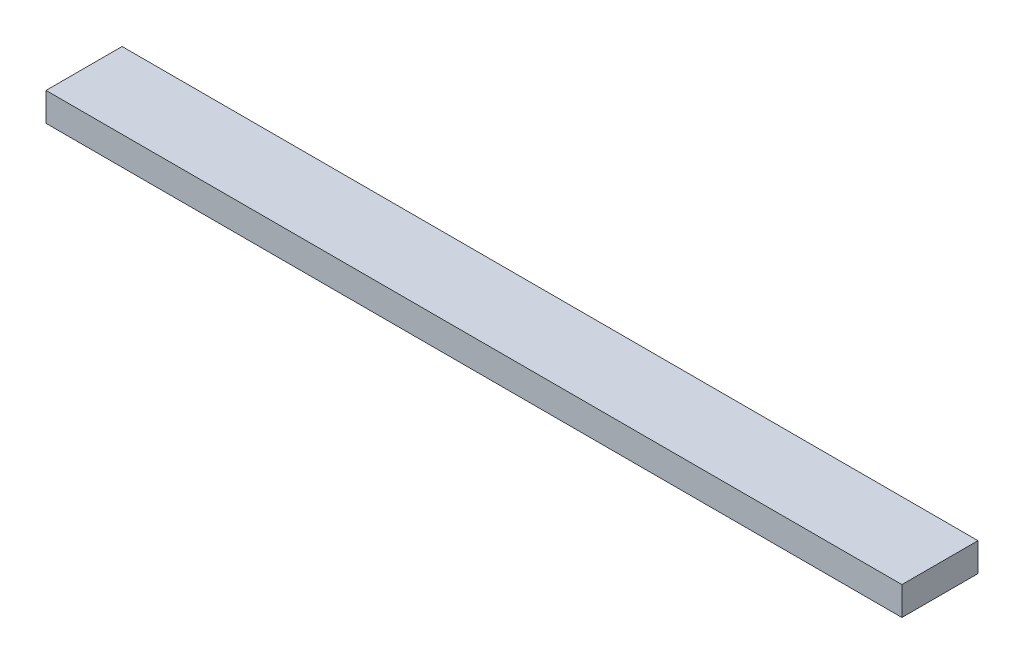
ISO-10303-21;
HEADER;
FILE_DESCRIPTION(('STEP AP214'),'2;1');
FILE_NAME('part.step','',(''),(''),'','','');
FILE_SCHEMA(('AUTOMOTIVE_DESIGN { 1 0 10303 214 1 1 1 1 }'));
ENDSEC;
DATA;
#1=APPLICATION_CONTEXT('core data for automotive mechanical design processes');
#2=APPLICATION_PROTOCOL_DEFINITION('international standard','automotive_design',2000,#1);
#3=PRODUCT_CONTEXT('',#1,'mechanical');
#4=PRODUCT('Part','Part','',(#3));
#5=PRODUCT_RELATED_PRODUCT_CATEGORY('part','',(#4));
#6=PRODUCT_DEFINITION_FORMATION('','',#4);
#7=PRODUCT_DEFINITION_CONTEXT('part definition',#1,'design');
#8=PRODUCT_DEFINITION('design','',#6,#7);
#9=PRODUCT_DEFINITION_SHAPE('','',#8);
#10=(LENGTH_UNIT() NAMED_UNIT(*) SI_UNIT(.MILLI.,.METRE.));
#11=(NAMED_UNIT(*) PLANE_ANGLE_UNIT() SI_UNIT($,.RADIAN.));
#12=(NAMED_UNIT(*) SI_UNIT($,.STERADIAN.) SOLID_ANGLE_UNIT());
#13=UNCERTAINTY_MEASURE_WITH_UNIT(LENGTH_MEASURE(1.E-05),#10,'distance_accuracy_value','');
#14=(GEOMETRIC_REPRESENTATION_CONTEXT(3) GLOBAL_UNCERTAINTY_ASSIGNED_CONTEXT((#13)) GLOBAL_UNIT_ASSIGNED_CONTEXT((#10,
#11,#12)) REPRESENTATION_CONTEXT('',''));
#15=CARTESIAN_POINT('',(0.,0.,0.));
#16=DIRECTION('',(0.,0.,1.));
#17=DIRECTION('',(1.,0.,0.));
#18=AXIS2_PLACEMENT_3D('',#15,#16,#17);
#19=CARTESIAN_POINT('',(-9.78343949044586,3.,-4.48407643312102));
#20=DIRECTION('',(-1.,0.,0.));
#21=DIRECTION('',(0.,0.,1.));
#22=AXIS2_PLACEMENT_3D('',#19,#20,#21);
#23=PLANE('',#22);
#24=DIRECTION('',(0.,0.,-1.));
#25=VECTOR('',#24,1.);
#26=CARTESIAN_POINT('',(-9.78343949044586,0.,-4.48407643312102));
#27=LINE('',#26,#25);
#28=CARTESIAN_POINT('',(-9.78343949044586,0.,-4.48407643312102));
#29=VERTEX_POINT('',#28);
#30=CARTESIAN_POINT('',(-9.78343949044586,0.,-12.484076433121));
#31=VERTEX_POINT('',#30);
#32=EDGE_CURVE('E96',#29,#31,#27,.T.);
#33=ORIENTED_EDGE('',*,*,#32,.T.);
#34=DIRECTION('',(0.,-1.,0.));
#35=VECTOR('',#34,1.);
#36=CARTESIAN_POINT('',(-9.78343949044586,3.,-12.484076433121));
#37=LINE('',#36,#35);
#38=CARTESIAN_POINT('',(-9.78343949044586,3.,-12.484076433121));
#39=VERTEX_POINT('',#38);
#40=EDGE_CURVE('E11',#39,#31,#37,.T.);
#41=ORIENTED_EDGE('',*,*,#40,.F.);
#42=DIRECTION('',(0.,0.,-1.));
#43=VECTOR('',#42,1.);
#44=CARTESIAN_POINT('',(-9.78343949044586,3.,-4.48407643312102));
#45=LINE('',#44,#43);
#46=CARTESIAN_POINT('',(-9.78343949044586,3.,-4.48407643312102));
#47=VERTEX_POINT('',#46);
#48=EDGE_CURVE('E84',#47,#39,#45,.T.);
#49=ORIENTED_EDGE('',*,*,#48,.F.);
#50=DIRECTION('',(0.,-1.,0.));
#51=VECTOR('',#50,1.);
#52=CARTESIAN_POINT('',(-9.78343949044586,3.,-4.48407643312102));
#53=LINE('',#52,#51);
#54=EDGE_CURVE('E92',#47,#29,#53,.T.);
#55=ORIENTED_EDGE('',*,*,#54,.T.);
#56=EDGE_LOOP('',(#33,#41,#49,#55));
#57=FACE_BOUND('',#56,.T.);
#58=ADVANCED_FACE('F33',(#57),#23,.F.);
#59=CARTESIAN_POINT('',(-9.78343949044586,3.,-12.484076433121));
#60=DIRECTION('',(0.,0.,1.));
#61=DIRECTION('',(1.,0.,0.));
#62=AXIS2_PLACEMENT_3D('',#59,#60,#61);
#63=PLANE('',#62);
#64=DIRECTION('',(-1.,0.,0.));
#65=VECTOR('',#64,1.);
#66=CARTESIAN_POINT('',(-9.78343949044586,0.,-12.484076433121));
#67=LINE('',#66,#65);
#68=CARTESIAN_POINT('',(-99.7834394904459,0.,-12.484076433121));
#69=VERTEX_POINT('',#68);
#70=EDGE_CURVE('E88',#31,#69,#67,.T.);
#71=ORIENTED_EDGE('',*,*,#70,.T.);
#72=DIRECTION('',(0.,-1.,0.));
#73=VECTOR('',#72,1.);
#74=CARTESIAN_POINT('',(-99.7834394904459,3.,-12.484076433121));
#75=LINE('',#74,#73);
#76=CARTESIAN_POINT('',(-99.7834394904459,3.,-12.484076433121));
#77=VERTEX_POINT('',#76);
#78=EDGE_CURVE('E41',#77,#69,#75,.T.);
#79=ORIENTED_EDGE('',*,*,#78,.F.);
#80=DIRECTION('',(-1.,0.,0.));
#81=VECTOR('',#80,1.);
#82=CARTESIAN_POINT('',(-9.78343949044586,3.,-12.484076433121));
#83=LINE('',#82,#81);
#84=EDGE_CURVE('E79',#39,#77,#83,.T.);
#85=ORIENTED_EDGE('',*,*,#84,.F.);
#86=ORIENTED_EDGE('',*,*,#40,.T.);
#87=EDGE_LOOP('',(#71,#79,#85,#86));
#88=FACE_BOUND('',#87,.T.);
#89=ADVANCED_FACE('F87',(#88),#63,.F.);
#90=CARTESIAN_POINT('',(-99.7834394904459,3.,-4.48407643312101));
#91=DIRECTION('',(1.,0.,0.));
#92=DIRECTION('',(0.,0.,-1.));
#93=AXIS2_PLACEMENT_3D('',#90,#91,#92);
#94=PLANE('',#93);
#95=DIRECTION('',(0.,0.,1.));
#96=VECTOR('',#95,1.);
#97=CARTESIAN_POINT('',(-99.7834394904459,0.,-4.48407643312101));
#98=LINE('',#97,#96);
#99=CARTESIAN_POINT('',(-99.7834394904459,0.,-4.48407643312101));
#100=VERTEX_POINT('',#99);
#101=EDGE_CURVE('E66',#69,#100,#98,.T.);
#102=ORIENTED_EDGE('',*,*,#101,.T.);
#103=DIRECTION('',(0.,-1.,0.));
#104=VECTOR('',#103,1.);
#105=CARTESIAN_POINT('',(-99.7834394904459,3.,-4.48407643312101));
#106=LINE('',#105,#104);
#107=CARTESIAN_POINT('',(-99.7834394904459,3.,-4.48407643312101));
#108=VERTEX_POINT('',#107);
#109=EDGE_CURVE('E89',#108,#100,#106,.T.);
#110=ORIENTED_EDGE('',*,*,#109,.F.);
#111=DIRECTION('',(0.,0.,1.));
#112=VECTOR('',#111,1.);
#113=CARTESIAN_POINT('',(-99.7834394904459,3.,-4.48407643312101));
#114=LINE('',#113,#112);
#115=EDGE_CURVE('E82',#77,#108,#114,.T.);
#116=ORIENTED_EDGE('',*,*,#115,.F.);
#117=ORIENTED_EDGE('',*,*,#78,.T.);
#118=EDGE_LOOP('',(#102,#110,#116,#117));
#119=FACE_BOUND('',#118,.T.);
#120=ADVANCED_FACE('F90',(#119),#94,.F.);
#121=CARTESIAN_POINT('',(-9.78343949044586,3.,-4.48407643312102));
#122=DIRECTION('',(0.,0.,-1.));
#123=DIRECTION('',(-1.,0.,0.));
#124=AXIS2_PLACEMENT_3D('',#121,#122,#123);
#125=PLANE('',#124);
#126=DIRECTION('',(1.,0.,0.));
#127=VECTOR('',#126,1.);
#128=CARTESIAN_POINT('',(-9.78343949044586,0.,-4.48407643312102));
#129=LINE('',#128,#127);
#130=EDGE_CURVE('E72',#100,#29,#129,.T.);
#131=ORIENTED_EDGE('',*,*,#130,.T.);
#132=ORIENTED_EDGE('',*,*,#54,.F.);
#133=DIRECTION('',(1.,0.,0.));
#134=VECTOR('',#133,1.);
#135=CARTESIAN_POINT('',(-9.78343949044586,3.,-4.48407643312102));
#136=LINE('',#135,#134);
#137=EDGE_CURVE('E49',#108,#47,#136,.T.);
#138=ORIENTED_EDGE('',*,*,#137,.F.);
#139=ORIENTED_EDGE('',*,*,#109,.T.);
#140=EDGE_LOOP('',(#131,#132,#138,#139));
#141=FACE_BOUND('',#140,.T.);
#142=ADVANCED_FACE('F103',(#141),#125,.F.);
#143=CARTESIAN_POINT('',(0.,3.,0.));
#144=DIRECTION('',(0.,1.,0.));
#145=DIRECTION('',(0.,0.,1.));
#146=AXIS2_PLACEMENT_3D('',#143,#144,#145);
#147=PLANE('',#146);
#148=ORIENTED_EDGE('',*,*,#48,.T.);
#149=ORIENTED_EDGE('',*,*,#84,.T.);
#150=ORIENTED_EDGE('',*,*,#115,.T.);
#151=ORIENTED_EDGE('',*,*,#137,.T.);
#152=EDGE_LOOP('',(#148,#149,#150,#151));
#153=FACE_BOUND('',#152,.T.);
#154=ADVANCED_FACE('F80',(#153),#147,.T.);
#155=CARTESIAN_POINT('',(0.,0.,0.));
#156=DIRECTION('',(0.,1.,0.));
#157=DIRECTION('',(0.,0.,1.));
#158=AXIS2_PLACEMENT_3D('',#155,#156,#157);
#159=PLANE('',#158);
#160=ORIENTED_EDGE('',*,*,#32,.F.);
#161=ORIENTED_EDGE('',*,*,#130,.F.);
#162=ORIENTED_EDGE('',*,*,#101,.F.);
#163=ORIENTED_EDGE('',*,*,#70,.F.);
#164=EDGE_LOOP('',(#160,#161,#162,#163));
#165=FACE_BOUND('',#164,.T.);
#166=ADVANCED_FACE('F106',(#165),#159,.F.);
#167=CLOSED_SHELL('',(#58,#89,#120,#142,#154,#166));
#168=MANIFOLD_SOLID_BREP('B2',#167);
#169=ADVANCED_BREP_SHAPE_REPRESENTATION('',(#18,#168),#14);
#170=SHAPE_DEFINITION_REPRESENTATION(#9,#169);
ENDSEC;
END-ISO-10303-21;
